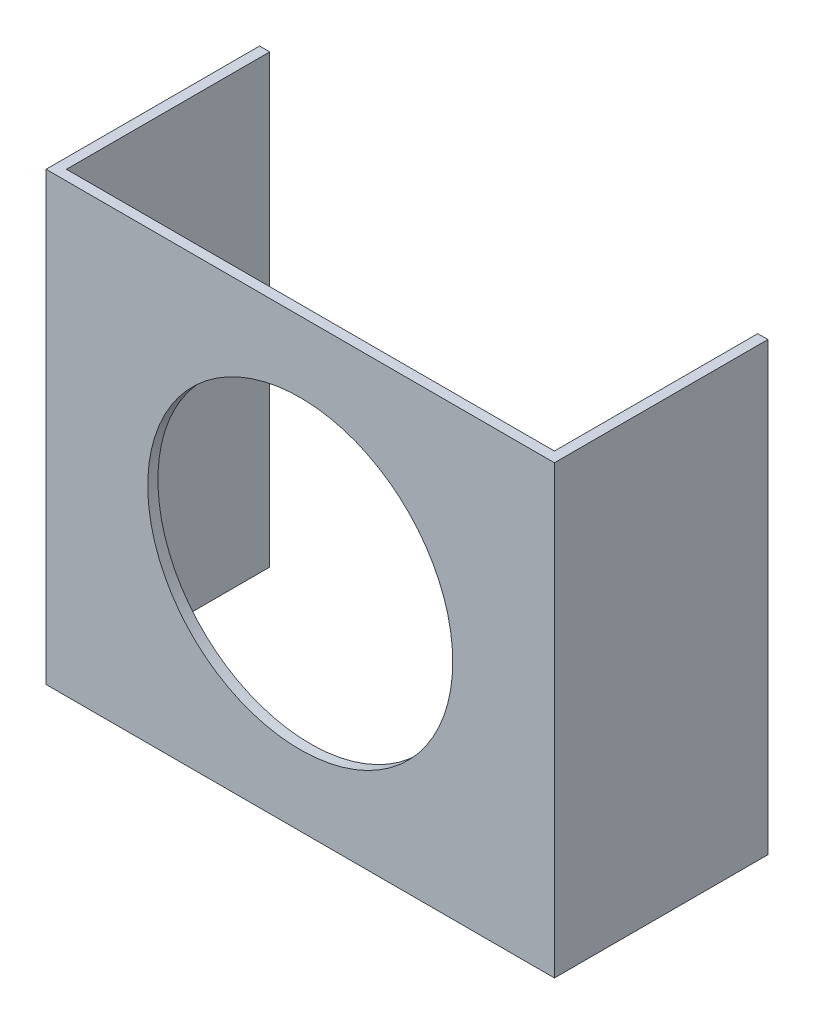
ISO-10303-21;
HEADER;
FILE_DESCRIPTION(('STEP AP214'),'2;1');
FILE_NAME('part.step','',(''),(''),'','','');
FILE_SCHEMA(('AUTOMOTIVE_DESIGN { 1 0 10303 214 1 1 1 1 }'));
ENDSEC;
DATA;
#1=APPLICATION_CONTEXT('core data for automotive mechanical design processes');
#2=APPLICATION_PROTOCOL_DEFINITION('international standard','automotive_design',2000,#1);
#3=PRODUCT_CONTEXT('',#1,'mechanical');
#4=PRODUCT('Part','Part','',(#3));
#5=PRODUCT_RELATED_PRODUCT_CATEGORY('part','',(#4));
#6=PRODUCT_DEFINITION_FORMATION('','',#4);
#7=PRODUCT_DEFINITION_CONTEXT('part definition',#1,'design');
#8=PRODUCT_DEFINITION('design','',#6,#7);
#9=PRODUCT_DEFINITION_SHAPE('','',#8);
#10=(LENGTH_UNIT() NAMED_UNIT(*) SI_UNIT(.MILLI.,.METRE.));
#11=(NAMED_UNIT(*) PLANE_ANGLE_UNIT() SI_UNIT($,.RADIAN.));
#12=(NAMED_UNIT(*) SI_UNIT($,.STERADIAN.) SOLID_ANGLE_UNIT());
#13=UNCERTAINTY_MEASURE_WITH_UNIT(LENGTH_MEASURE(1.E-05),#10,'distance_accuracy_value','');
#14=(GEOMETRIC_REPRESENTATION_CONTEXT(3) GLOBAL_UNCERTAINTY_ASSIGNED_CONTEXT((#13)) GLOBAL_UNIT_ASSIGNED_CONTEXT((#10,
#11,#12)) REPRESENTATION_CONTEXT('',''));
#15=CARTESIAN_POINT('',(0.,0.,0.));
#16=DIRECTION('',(0.,0.,1.));
#17=DIRECTION('',(1.,0.,0.));
#18=AXIS2_PLACEMENT_3D('',#15,#16,#17);
#19=CARTESIAN_POINT('',(0.,0.,0.));
#20=DIRECTION('',(0.,0.,1.));
#21=DIRECTION('',(1.,0.,0.));
#22=AXIS2_PLACEMENT_3D('',#19,#20,#21);
#23=PLANE('',#22);
#24=CARTESIAN_POINT('',(0.,0.,0.));
#25=DIRECTION('',(0.,0.,1.));
#26=DIRECTION('',(1.,0.,0.));
#27=AXIS2_PLACEMENT_3D('',#24,#25,#26);
#28=CIRCLE('',#27,15.);
#29=CARTESIAN_POINT('',(15.,0.,0.));
#30=VERTEX_POINT('',#29);
#31=EDGE_CURVE('E118',#30,#30,#28,.T.);
#32=ORIENTED_EDGE('',*,*,#31,.T.);
#33=EDGE_LOOP('',(#32));
#34=FACE_BOUND('',#33,.T.);
#35=DIRECTION('',(0.,1.,0.));
#36=VECTOR('',#35,1.);
#37=CARTESIAN_POINT('',(24.0000002980232,-21.9441676595291,0.));
#38=LINE('',#37,#36);
#39=CARTESIAN_POINT('',(24.0000002980232,-21.9441676595291,0.));
#40=VERTEX_POINT('',#39);
#41=CARTESIAN_POINT('',(24.0000002980232,21.9441676595291,0.));
#42=VERTEX_POINT('',#41);
#43=EDGE_CURVE('E112',#40,#42,#38,.T.);
#44=ORIENTED_EDGE('',*,*,#43,.F.);
#45=DIRECTION('',(1.,0.,0.));
#46=VECTOR('',#45,1.);
#47=CARTESIAN_POINT('',(-25.0000002980232,-21.9441676595291,0.));
#48=LINE('',#47,#46);
#49=CARTESIAN_POINT('',(-24.0000002980232,-21.9441676595291,0.));
#50=VERTEX_POINT('',#49);
#51=EDGE_CURVE('E121',#50,#40,#48,.T.);
#52=ORIENTED_EDGE('',*,*,#51,.F.);
#53=DIRECTION('',(0.,-1.,0.));
#54=VECTOR('',#53,1.);
#55=CARTESIAN_POINT('',(-24.0000002980232,0.,0.));
#56=LINE('',#55,#54);
#57=CARTESIAN_POINT('',(-24.0000002980232,21.9441676595291,0.));
#58=VERTEX_POINT('',#57);
#59=EDGE_CURVE('E123',#58,#50,#56,.T.);
#60=ORIENTED_EDGE('',*,*,#59,.F.);
#61=DIRECTION('',(-1.,0.,0.));
#62=VECTOR('',#61,1.);
#63=CARTESIAN_POINT('',(-25.0000002980232,21.9441676595291,0.));
#64=LINE('',#63,#62);
#65=EDGE_CURVE('E56',#42,#58,#64,.T.);
#66=ORIENTED_EDGE('',*,*,#65,.F.);
#67=EDGE_LOOP('',(#44,#52,#60,#66));
#68=FACE_BOUND('',#67,.T.);
#69=ADVANCED_FACE('F41',(#34,#68),#23,.F.);
#70=CARTESIAN_POINT('',(25.0000002980232,21.9441676595291,1.));
#71=DIRECTION('',(-1.,0.,0.));
#72=DIRECTION('',(0.,0.,1.));
#73=AXIS2_PLACEMENT_3D('',#70,#71,#72);
#74=PLANE('',#73);
#75=DIRECTION('',(0.,0.,-1.));
#76=VECTOR('',#75,1.);
#77=CARTESIAN_POINT('',(25.0000002980232,-21.9441676595291,1.));
#78=LINE('',#77,#76);
#79=CARTESIAN_POINT('',(25.0000002980232,-21.9441676595291,1.));
#80=VERTEX_POINT('',#79);
#81=CARTESIAN_POINT('',(25.0000002980232,-21.9441676595291,-20.));
#82=VERTEX_POINT('',#81);
#83=EDGE_CURVE('E139',#80,#82,#78,.T.);
#84=ORIENTED_EDGE('',*,*,#83,.T.);
#85=DIRECTION('',(0.,-1.,0.));
#86=VECTOR('',#85,1.);
#87=CARTESIAN_POINT('',(25.0000002980232,21.9441676595291,-20.));
#88=LINE('',#87,#86);
#89=CARTESIAN_POINT('',(25.0000002980232,21.9441676595291,-20.));
#90=VERTEX_POINT('',#89);
#91=EDGE_CURVE('E179',#90,#82,#88,.T.);
#92=ORIENTED_EDGE('',*,*,#91,.F.);
#93=DIRECTION('',(0.,0.,-1.));
#94=VECTOR('',#93,1.);
#95=CARTESIAN_POINT('',(25.0000002980232,21.9441676595291,1.));
#96=LINE('',#95,#94);
#97=CARTESIAN_POINT('',(25.0000002980232,21.9441676595291,1.));
#98=VERTEX_POINT('',#97);
#99=EDGE_CURVE('E11',#98,#90,#96,.T.);
#100=ORIENTED_EDGE('',*,*,#99,.F.);
#101=DIRECTION('',(0.,1.,0.));
#102=VECTOR('',#101,1.);
#103=CARTESIAN_POINT('',(25.0000002980232,21.9441676595291,1.));
#104=LINE('',#103,#102);
#105=EDGE_CURVE('E131',#80,#98,#104,.T.);
#106=ORIENTED_EDGE('',*,*,#105,.F.);
#107=EDGE_LOOP('',(#84,#92,#100,#106));
#108=FACE_BOUND('',#107,.T.);
#109=ADVANCED_FACE('F43',(#108),#74,.F.);
#110=CARTESIAN_POINT('',(-25.0000002980232,21.9441676595291,1.));
#111=DIRECTION('',(0.,-1.,0.));
#112=DIRECTION('',(0.,0.,-1.));
#113=AXIS2_PLACEMENT_3D('',#110,#111,#112);
#114=PLANE('',#113);
#115=ORIENTED_EDGE('',*,*,#99,.T.);
#116=DIRECTION('',(-1.,0.,0.));
#117=VECTOR('',#116,1.);
#118=CARTESIAN_POINT('',(25.0000002980232,21.9441676595291,-20.));
#119=LINE('',#118,#117);
#120=CARTESIAN_POINT('',(24.0000002980232,21.9441676595291,-20.));
#121=VERTEX_POINT('',#120);
#122=EDGE_CURVE('E124',#90,#121,#119,.T.);
#123=ORIENTED_EDGE('',*,*,#122,.T.);
#124=DIRECTION('',(0.,0.,1.));
#125=VECTOR('',#124,1.);
#126=CARTESIAN_POINT('',(24.0000002980232,21.9441676595291,-20.));
#127=LINE('',#126,#125);
#128=EDGE_CURVE('E117',#121,#42,#127,.T.);
#129=ORIENTED_EDGE('',*,*,#128,.T.);
#130=ORIENTED_EDGE('',*,*,#65,.T.);
#131=DIRECTION('',(0.,0.,1.));
#132=VECTOR('',#131,1.);
#133=CARTESIAN_POINT('',(-24.0000002980232,21.9441676595291,-20.));
#134=LINE('',#133,#132);
#135=CARTESIAN_POINT('',(-24.0000002980232,21.9441676595291,-20.));
#136=VERTEX_POINT('',#135);
#137=EDGE_CURVE('E135',#136,#58,#134,.T.);
#138=ORIENTED_EDGE('',*,*,#137,.F.);
#139=DIRECTION('',(1.,0.,0.));
#140=VECTOR('',#139,1.);
#141=CARTESIAN_POINT('',(0.,21.9441676595291,-20.));
#142=LINE('',#141,#140);
#143=CARTESIAN_POINT('',(-25.0000002980232,21.9441676595291,-20.));
#144=VERTEX_POINT('',#143);
#145=EDGE_CURVE('E156',#144,#136,#142,.T.);
#146=ORIENTED_EDGE('',*,*,#145,.F.);
#147=DIRECTION('',(0.,0.,-1.));
#148=VECTOR('',#147,1.);
#149=CARTESIAN_POINT('',(-25.0000002980232,21.9441676595291,1.));
#150=LINE('',#149,#148);
#151=CARTESIAN_POINT('',(-25.0000002980232,21.9441676595291,1.));
#152=VERTEX_POINT('',#151);
#153=EDGE_CURVE('E49',#152,#144,#150,.T.);
#154=ORIENTED_EDGE('',*,*,#153,.F.);
#155=DIRECTION('',(-1.,0.,0.));
#156=VECTOR('',#155,1.);
#157=CARTESIAN_POINT('',(-25.0000002980232,21.9441676595291,1.));
#158=LINE('',#157,#156);
#159=EDGE_CURVE('E133',#98,#152,#158,.T.);
#160=ORIENTED_EDGE('',*,*,#159,.F.);
#161=EDGE_LOOP('',(#115,#123,#129,#130,#138,#146,#154,#160));
#162=FACE_BOUND('',#161,.T.);
#163=ADVANCED_FACE('F159',(#162),#114,.F.);
#164=CARTESIAN_POINT('',(-25.0000002980232,21.9441676595291,1.));
#165=DIRECTION('',(1.,0.,0.));
#166=DIRECTION('',(0.,0.,-1.));
#167=AXIS2_PLACEMENT_3D('',#164,#165,#166);
#168=PLANE('',#167);
#169=ORIENTED_EDGE('',*,*,#153,.T.);
#170=DIRECTION('',(0.,1.,0.));
#171=VECTOR('',#170,1.);
#172=CARTESIAN_POINT('',(-25.0000002980232,0.,-20.));
#173=LINE('',#172,#171);
#174=CARTESIAN_POINT('',(-25.0000002980232,-21.9441676595291,-20.));
#175=VERTEX_POINT('',#174);
#176=EDGE_CURVE('E149',#175,#144,#173,.T.);
#177=ORIENTED_EDGE('',*,*,#176,.F.);
#178=DIRECTION('',(0.,0.,-1.));
#179=VECTOR('',#178,1.);
#180=CARTESIAN_POINT('',(-25.0000002980232,-21.9441676595291,1.));
#181=LINE('',#180,#179);
#182=CARTESIAN_POINT('',(-25.0000002980232,-21.9441676595291,1.));
#183=VERTEX_POINT('',#182);
#184=EDGE_CURVE('E141',#183,#175,#181,.T.);
#185=ORIENTED_EDGE('',*,*,#184,.F.);
#186=DIRECTION('',(0.,-1.,0.));
#187=VECTOR('',#186,1.);
#188=CARTESIAN_POINT('',(-25.0000002980232,21.9441676595291,1.));
#189=LINE('',#188,#187);
#190=EDGE_CURVE('E150',#152,#183,#189,.T.);
#191=ORIENTED_EDGE('',*,*,#190,.F.);
#192=EDGE_LOOP('',(#169,#177,#185,#191));
#193=FACE_BOUND('',#192,.T.);
#194=ADVANCED_FACE('F147',(#193),#168,.F.);
#195=CARTESIAN_POINT('',(-25.0000002980232,-21.9441676595291,1.));
#196=DIRECTION('',(0.,1.,0.));
#197=DIRECTION('',(0.,0.,1.));
#198=AXIS2_PLACEMENT_3D('',#195,#196,#197);
#199=PLANE('',#198);
#200=ORIENTED_EDGE('',*,*,#184,.T.);
#201=DIRECTION('',(-1.,0.,0.));
#202=VECTOR('',#201,1.);
#203=CARTESIAN_POINT('',(0.,-21.9441676595291,-20.));
#204=LINE('',#203,#202);
#205=CARTESIAN_POINT('',(-24.0000002980232,-21.9441676595291,-20.));
#206=VERTEX_POINT('',#205);
#207=EDGE_CURVE('E157',#206,#175,#204,.T.);
#208=ORIENTED_EDGE('',*,*,#207,.F.);
#209=DIRECTION('',(0.,0.,1.));
#210=VECTOR('',#209,1.);
#211=CARTESIAN_POINT('',(-24.0000002980232,-21.9441676595291,-20.));
#212=LINE('',#211,#210);
#213=EDGE_CURVE('E130',#206,#50,#212,.T.);
#214=ORIENTED_EDGE('',*,*,#213,.T.);
#215=ORIENTED_EDGE('',*,*,#51,.T.);
#216=DIRECTION('',(0.,0.,1.));
#217=VECTOR('',#216,1.);
#218=CARTESIAN_POINT('',(24.0000002980232,-21.9441676595291,-20.));
#219=LINE('',#218,#217);
#220=CARTESIAN_POINT('',(24.0000002980232,-21.9441676595291,-20.));
#221=VERTEX_POINT('',#220);
#222=EDGE_CURVE('E108',#221,#40,#219,.T.);
#223=ORIENTED_EDGE('',*,*,#222,.F.);
#224=DIRECTION('',(-1.,0.,0.));
#225=VECTOR('',#224,1.);
#226=CARTESIAN_POINT('',(25.0000002980232,-21.9441676595291,-20.));
#227=LINE('',#226,#225);
#228=EDGE_CURVE('E174',#82,#221,#227,.T.);
#229=ORIENTED_EDGE('',*,*,#228,.F.);
#230=ORIENTED_EDGE('',*,*,#83,.F.);
#231=DIRECTION('',(1.,0.,0.));
#232=VECTOR('',#231,1.);
#233=CARTESIAN_POINT('',(-25.0000002980232,-21.9441676595291,1.));
#234=LINE('',#233,#232);
#235=EDGE_CURVE('E64',#183,#80,#234,.T.);
#236=ORIENTED_EDGE('',*,*,#235,.F.);
#237=EDGE_LOOP('',(#200,#208,#214,#215,#223,#229,#230,#236));
#238=FACE_BOUND('',#237,.T.);
#239=ADVANCED_FACE('F127',(#238),#199,.F.);
#240=CARTESIAN_POINT('',(0.,0.,1.));
#241=DIRECTION('',(0.,0.,1.));
#242=DIRECTION('',(1.,0.,0.));
#243=AXIS2_PLACEMENT_3D('',#240,#241,#242);
#244=PLANE('',#243);
#245=CARTESIAN_POINT('',(0.,0.,1.));
#246=DIRECTION('',(0.,0.,1.));
#247=DIRECTION('',(1.,0.,0.));
#248=AXIS2_PLACEMENT_3D('',#245,#246,#247);
#249=CIRCLE('',#248,15.);
#250=CARTESIAN_POINT('',(15.,0.,1.));
#251=VERTEX_POINT('',#250);
#252=EDGE_CURVE('E189',#251,#251,#249,.T.);
#253=ORIENTED_EDGE('',*,*,#252,.F.);
#254=EDGE_LOOP('',(#253));
#255=FACE_BOUND('',#254,.T.);
#256=ORIENTED_EDGE('',*,*,#105,.T.);
#257=ORIENTED_EDGE('',*,*,#159,.T.);
#258=ORIENTED_EDGE('',*,*,#190,.T.);
#259=ORIENTED_EDGE('',*,*,#235,.T.);
#260=EDGE_LOOP('',(#256,#257,#258,#259));
#261=FACE_BOUND('',#260,.T.);
#262=ADVANCED_FACE('F172',(#255,#261),#244,.T.);
#263=CARTESIAN_POINT('',(-24.0000002980232,0.,-20.));
#264=DIRECTION('',(-1.,0.,0.));
#265=DIRECTION('',(0.,0.,1.));
#266=AXIS2_PLACEMENT_3D('',#263,#264,#265);
#267=PLANE('',#266);
#268=ORIENTED_EDGE('',*,*,#59,.T.);
#269=ORIENTED_EDGE('',*,*,#213,.F.);
#270=DIRECTION('',(0.,-1.,0.));
#271=VECTOR('',#270,1.);
#272=CARTESIAN_POINT('',(-24.0000002980232,0.,-20.));
#273=LINE('',#272,#271);
#274=EDGE_CURVE('E161',#136,#206,#273,.T.);
#275=ORIENTED_EDGE('',*,*,#274,.F.);
#276=ORIENTED_EDGE('',*,*,#137,.T.);
#277=EDGE_LOOP('',(#268,#269,#275,#276));
#278=FACE_BOUND('',#277,.T.);
#279=ADVANCED_FACE('F197',(#278),#267,.F.);
#280=CARTESIAN_POINT('',(0.,0.,-20.));
#281=DIRECTION('',(0.,0.,-1.));
#282=DIRECTION('',(-1.,0.,0.));
#283=AXIS2_PLACEMENT_3D('',#280,#281,#282);
#284=PLANE('',#283);
#285=ORIENTED_EDGE('',*,*,#145,.T.);
#286=ORIENTED_EDGE('',*,*,#274,.T.);
#287=ORIENTED_EDGE('',*,*,#207,.T.);
#288=ORIENTED_EDGE('',*,*,#176,.T.);
#289=EDGE_LOOP('',(#285,#286,#287,#288));
#290=FACE_BOUND('',#289,.T.);
#291=ADVANCED_FACE('F155',(#290),#284,.T.);
#292=CARTESIAN_POINT('',(24.0000002980232,-21.9441676595291,-20.));
#293=DIRECTION('',(1.,0.,0.));
#294=DIRECTION('',(0.,0.,-1.));
#295=AXIS2_PLACEMENT_3D('',#292,#293,#294);
#296=PLANE('',#295);
#297=ORIENTED_EDGE('',*,*,#43,.T.);
#298=ORIENTED_EDGE('',*,*,#128,.F.);
#299=DIRECTION('',(0.,1.,0.));
#300=VECTOR('',#299,1.);
#301=CARTESIAN_POINT('',(24.0000002980232,-21.9441676595291,-20.));
#302=LINE('',#301,#300);
#303=EDGE_CURVE('E113',#221,#121,#302,.T.);
#304=ORIENTED_EDGE('',*,*,#303,.F.);
#305=ORIENTED_EDGE('',*,*,#222,.T.);
#306=EDGE_LOOP('',(#297,#298,#304,#305));
#307=FACE_BOUND('',#306,.T.);
#308=ADVANCED_FACE('F110',(#307),#296,.F.);
#309=CARTESIAN_POINT('',(0.,0.,-20.));
#310=DIRECTION('',(0.,0.,-1.));
#311=DIRECTION('',(-1.,0.,0.));
#312=AXIS2_PLACEMENT_3D('',#309,#310,#311);
#313=PLANE('',#312);
#314=ORIENTED_EDGE('',*,*,#122,.F.);
#315=ORIENTED_EDGE('',*,*,#91,.T.);
#316=ORIENTED_EDGE('',*,*,#228,.T.);
#317=ORIENTED_EDGE('',*,*,#303,.T.);
#318=EDGE_LOOP('',(#314,#315,#316,#317));
#319=FACE_BOUND('',#318,.T.);
#320=ADVANCED_FACE('F251',(#319),#313,.T.);
#321=CARTESIAN_POINT('',(0.,0.,-20.));
#322=DIRECTION('',(0.,0.,1.));
#323=DIRECTION('',(1.,0.,0.));
#324=AXIS2_PLACEMENT_3D('',#321,#322,#323);
#325=CYLINDRICAL_SURFACE('',#324,15.);
#326=ORIENTED_EDGE('',*,*,#252,.T.);
#327=EDGE_LOOP('',(#326));
#328=FACE_BOUND('',#327,.T.);
#329=ORIENTED_EDGE('',*,*,#31,.F.);
#330=EDGE_LOOP('',(#329));
#331=FACE_BOUND('',#330,.T.);
#332=ADVANCED_FACE('F193',(#328,#331),#325,.F.);
#333=CLOSED_SHELL('',(#69,#109,#163,#194,#239,#262,#279,#291,#308,#320,#332));
#334=MANIFOLD_SOLID_BREP('B2',#333);
#335=ADVANCED_BREP_SHAPE_REPRESENTATION('',(#18,#334),#14);
#336=SHAPE_DEFINITION_REPRESENTATION(#9,#335);
ENDSEC;
END-ISO-10303-21;
